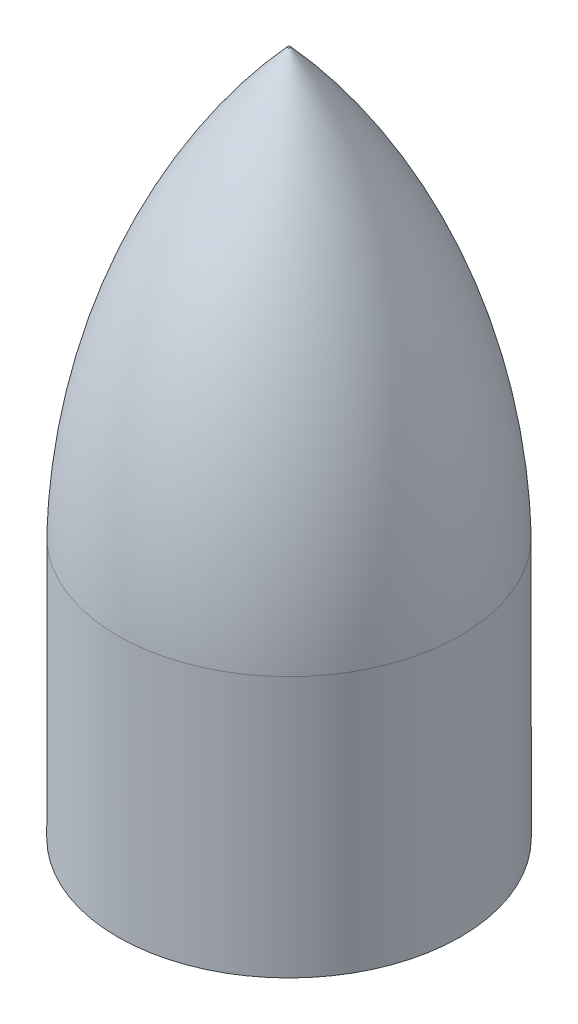
ISO-10303-21;
HEADER;
FILE_DESCRIPTION(('STEP AP214'),'2;1');
FILE_NAME('part.step','',(''),(''),'','','');
FILE_SCHEMA(('AUTOMOTIVE_DESIGN { 1 0 10303 214 1 1 1 1 }'));
ENDSEC;
DATA;
#1=APPLICATION_CONTEXT('core data for automotive mechanical design processes');
#2=APPLICATION_PROTOCOL_DEFINITION('international standard','automotive_design',2000,#1);
#3=PRODUCT_CONTEXT('',#1,'mechanical');
#4=PRODUCT('Part','Part','',(#3));
#5=PRODUCT_RELATED_PRODUCT_CATEGORY('part','',(#4));
#6=PRODUCT_DEFINITION_FORMATION('','',#4);
#7=PRODUCT_DEFINITION_CONTEXT('part definition',#1,'design');
#8=PRODUCT_DEFINITION('design','',#6,#7);
#9=PRODUCT_DEFINITION_SHAPE('','',#8);
#10=(LENGTH_UNIT() NAMED_UNIT(*) SI_UNIT(.MILLI.,.METRE.));
#11=(NAMED_UNIT(*) PLANE_ANGLE_UNIT() SI_UNIT($,.RADIAN.));
#12=(NAMED_UNIT(*) SI_UNIT($,.STERADIAN.) SOLID_ANGLE_UNIT());
#13=UNCERTAINTY_MEASURE_WITH_UNIT(LENGTH_MEASURE(1.E-05),#10,'distance_accuracy_value','');
#14=(GEOMETRIC_REPRESENTATION_CONTEXT(3) GLOBAL_UNCERTAINTY_ASSIGNED_CONTEXT((#13)) GLOBAL_UNIT_ASSIGNED_CONTEXT((#10,
#11,#12)) REPRESENTATION_CONTEXT('',''));
#15=CARTESIAN_POINT('',(0.,0.,0.));
#16=DIRECTION('',(0.,0.,1.));
#17=DIRECTION('',(1.,0.,0.));
#18=AXIS2_PLACEMENT_3D('',#15,#16,#17);
#19=CARTESIAN_POINT('',(0.,6.,0.));
#20=DIRECTION('',(0.,-1.,0.));
#21=DIRECTION('',(0.,0.,-1.));
#22=AXIS2_PLACEMENT_3D('',#19,#20,#21);
#23=CYLINDRICAL_SURFACE('',#22,1.5);
#24=CARTESIAN_POINT('',(0.,0.,0.));
#25=DIRECTION('',(0.,1.,0.));
#26=DIRECTION('',(0.,0.,1.));
#27=AXIS2_PLACEMENT_3D('',#24,#25,#26);
#28=CIRCLE('',#27,1.5);
#29=CARTESIAN_POINT('',(0.,0.,1.5));
#30=VERTEX_POINT('',#29);
#31=EDGE_CURVE('E10',#30,#30,#28,.T.);
#32=ORIENTED_EDGE('',*,*,#31,.T.);
#33=EDGE_LOOP('',(#32));
#34=FACE_BOUND('',#33,.T.);
#35=CARTESIAN_POINT('',(0.,2.28524735819915,0.));
#36=DIRECTION('',(0.,-1.,0.));
#37=DIRECTION('',(1.,0.,0.));
#38=AXIS2_PLACEMENT_3D('',#35,#36,#37);
#39=CIRCLE('',#38,1.5);
#40=CARTESIAN_POINT('',(1.5,2.28524735819915,0.));
#41=VERTEX_POINT('',#40);
#42=EDGE_CURVE('E40',#41,#41,#39,.F.);
#43=ORIENTED_EDGE('',*,*,#42,.F.);
#44=EDGE_LOOP('',(#43));
#45=FACE_BOUND('',#44,.T.);
#46=ADVANCED_FACE('F34',(#34,#45),#23,.T.);
#47=CARTESIAN_POINT('',(0.,0.,0.));
#48=DIRECTION('',(0.,1.,0.));
#49=DIRECTION('',(0.,0.,1.));
#50=AXIS2_PLACEMENT_3D('',#47,#48,#49);
#51=PLANE('',#50);
#52=ORIENTED_EDGE('',*,*,#31,.F.);
#53=EDGE_LOOP('',(#52));
#54=FACE_BOUND('',#53,.T.);
#55=ADVANCED_FACE('F55',(#54),#51,.F.);
#56=CARTESIAN_POINT('',(0.,2.14262367909959,0.));
#57=DIRECTION('',(0.,1.,0.));
#58=DIRECTION('',(-1.,0.,0.));
#59=AXIS2_PLACEMENT_3D('',#56,#57,#58);
#60=DEGENERATE_TOROIDAL_SURFACE('',#59,4.23124515677963,5.7330194976949,.F.);
#61=CARTESIAN_POINT('',(0.,6.,0.));
#62=DIRECTION('',(0.,1.,0.));
#63=DIRECTION('',(-1.,0.,0.));
#64=AXIS2_PLACEMENT_3D('',#61,#62,#63);
#65=CIRCLE('',#64,0.00999999999999939);
#66=CARTESIAN_POINT('',(-0.00999999999999939,6.,0.));
#67=VERTEX_POINT('',#66);
#68=EDGE_CURVE('E44',#67,#67,#65,.T.);
#69=ORIENTED_EDGE('',*,*,#68,.F.);
#70=EDGE_LOOP('',(#69));
#71=FACE_BOUND('',#70,.T.);
#72=ORIENTED_EDGE('',*,*,#42,.T.);
#73=EDGE_LOOP('',(#72));
#74=FACE_BOUND('',#73,.T.);
#75=ADVANCED_FACE('F53',(#71,#74),#60,.F.);
#76=CARTESIAN_POINT('',(0.,6.,0.));
#77=DIRECTION('',(0.,1.,0.));
#78=DIRECTION('',(0.,0.,1.));
#79=AXIS2_PLACEMENT_3D('',#76,#77,#78);
#80=PLANE('',#79);
#81=ORIENTED_EDGE('',*,*,#68,.T.);
#82=EDGE_LOOP('',(#81));
#83=FACE_BOUND('',#82,.T.);
#84=ADVANCED_FACE('F51',(#83),#80,.T.);
#85=CLOSED_SHELL('',(#46,#55,#75,#84));
#86=MANIFOLD_SOLID_BREP('B2',#85);
#87=ADVANCED_BREP_SHAPE_REPRESENTATION('',(#18,#86),#14);
#88=SHAPE_DEFINITION_REPRESENTATION(#9,#87);
ENDSEC;
END-ISO-10303-21;
